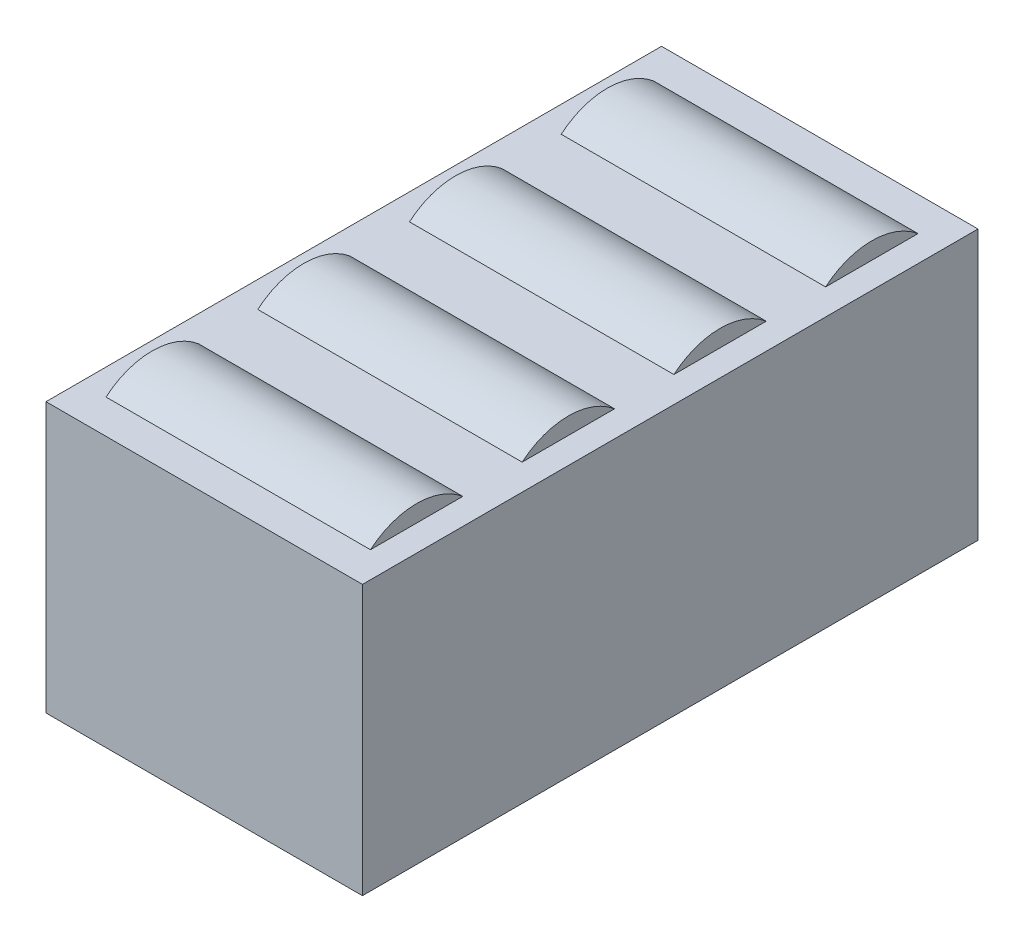
ISO-10303-21;
HEADER;
FILE_DESCRIPTION(('STEP AP214'),'2;1');
FILE_NAME('part.step','',(''),(''),'','','');
FILE_SCHEMA(('AUTOMOTIVE_DESIGN { 1 0 10303 214 1 1 1 1 }'));
ENDSEC;
DATA;
#1=APPLICATION_CONTEXT('core data for automotive mechanical design processes');
#2=APPLICATION_PROTOCOL_DEFINITION('international standard','automotive_design',2000,#1);
#3=PRODUCT_CONTEXT('',#1,'mechanical');
#4=PRODUCT('Part','Part','',(#3));
#5=PRODUCT_RELATED_PRODUCT_CATEGORY('part','',(#4));
#6=PRODUCT_DEFINITION_FORMATION('','',#4);
#7=PRODUCT_DEFINITION_CONTEXT('part definition',#1,'design');
#8=PRODUCT_DEFINITION('design','',#6,#7);
#9=PRODUCT_DEFINITION_SHAPE('','',#8);
#10=(LENGTH_UNIT() NAMED_UNIT(*) SI_UNIT(.MILLI.,.METRE.));
#11=(NAMED_UNIT(*) PLANE_ANGLE_UNIT() SI_UNIT($,.RADIAN.));
#12=(NAMED_UNIT(*) SI_UNIT($,.STERADIAN.) SOLID_ANGLE_UNIT());
#13=UNCERTAINTY_MEASURE_WITH_UNIT(LENGTH_MEASURE(1.E-05),#10,'distance_accuracy_value','');
#14=(GEOMETRIC_REPRESENTATION_CONTEXT(3) GLOBAL_UNCERTAINTY_ASSIGNED_CONTEXT((#13)) GLOBAL_UNIT_ASSIGNED_CONTEXT((#10,
#11,#12)) REPRESENTATION_CONTEXT('',''));
#15=CARTESIAN_POINT('',(0.,0.,0.));
#16=DIRECTION('',(0.,0.,1.));
#17=DIRECTION('',(1.,0.,0.));
#18=AXIS2_PLACEMENT_3D('',#15,#16,#17);
#19=CARTESIAN_POINT('',(0.,0.,142.));
#20=DIRECTION('',(0.,1.,0.));
#21=DIRECTION('',(0.,0.,1.));
#22=AXIS2_PLACEMENT_3D('',#19,#20,#21);
#23=PLANE('',#22);
#24=DIRECTION('',(0.,0.,1.));
#25=VECTOR('',#24,1.);
#26=CARTESIAN_POINT('',(67.,0.,142.));
#27=LINE('',#26,#25);
#28=CARTESIAN_POINT('',(67.,0.,42.8468314572612));
#29=VERTEX_POINT('',#28);
#30=CARTESIAN_POINT('',(67.,0.,64.1531685427388));
#31=VERTEX_POINT('',#30);
#32=EDGE_CURVE('E176',#29,#31,#27,.T.);
#33=ORIENTED_EDGE('',*,*,#32,.F.);
#34=DIRECTION('',(1.,0.,0.));
#35=VECTOR('',#34,1.);
#36=CARTESIAN_POINT('',(-46.6690475583122,0.,42.8468314572612));
#37=LINE('',#36,#35);
#38=CARTESIAN_POINT('',(6.,0.,42.8468314572612));
#39=VERTEX_POINT('',#38);
#40=EDGE_CURVE('E314',#29,#39,#37,.F.);
#41=ORIENTED_EDGE('',*,*,#40,.T.);
#42=DIRECTION('',(0.,0.,-1.));
#43=VECTOR('',#42,1.);
#44=CARTESIAN_POINT('',(6.,0.,142.));
#45=LINE('',#44,#43);
#46=CARTESIAN_POINT('',(6.,0.,64.1531685427388));
#47=VERTEX_POINT('',#46);
#48=EDGE_CURVE('E311',#47,#39,#45,.T.);
#49=ORIENTED_EDGE('',*,*,#48,.F.);
#50=DIRECTION('',(1.,0.,0.));
#51=VECTOR('',#50,1.);
#52=CARTESIAN_POINT('',(-46.6690475583122,0.,64.1531685427388));
#53=LINE('',#52,#51);
#54=EDGE_CURVE('E316',#47,#31,#53,.T.);
#55=ORIENTED_EDGE('',*,*,#54,.T.);
#56=EDGE_LOOP('',(#33,#41,#49,#55));
#57=FACE_BOUND('',#56,.T.);
#58=DIRECTION('',(0.,0.,1.));
#59=VECTOR('',#58,1.);
#60=CARTESIAN_POINT('',(67.,0.,142.));
#61=LINE('',#60,#59);
#62=CARTESIAN_POINT('',(67.,0.,112.846831457261));
#63=VERTEX_POINT('',#62);
#64=CARTESIAN_POINT('',(67.,0.,134.153168542739));
#65=VERTEX_POINT('',#64);
#66=EDGE_CURVE('E298',#63,#65,#61,.T.);
#67=ORIENTED_EDGE('',*,*,#66,.F.);
#68=DIRECTION('',(1.,0.,0.));
#69=VECTOR('',#68,1.);
#70=CARTESIAN_POINT('',(-46.6690475583122,0.,112.846831457261));
#71=LINE('',#70,#69);
#72=CARTESIAN_POINT('',(6.,0.,112.846831457261));
#73=VERTEX_POINT('',#72);
#74=EDGE_CURVE('E294',#63,#73,#71,.F.);
#75=ORIENTED_EDGE('',*,*,#74,.T.);
#76=DIRECTION('',(0.,0.,-1.));
#77=VECTOR('',#76,1.);
#78=CARTESIAN_POINT('',(6.,0.,142.));
#79=LINE('',#78,#77);
#80=CARTESIAN_POINT('',(6.,0.,134.153168542739));
#81=VERTEX_POINT('',#80);
#82=EDGE_CURVE('E291',#81,#73,#79,.T.);
#83=ORIENTED_EDGE('',*,*,#82,.F.);
#84=DIRECTION('',(1.,0.,0.));
#85=VECTOR('',#84,1.);
#86=CARTESIAN_POINT('',(-46.6690475583122,0.,134.153168542739));
#87=LINE('',#86,#85);
#88=EDGE_CURVE('E296',#81,#65,#87,.T.);
#89=ORIENTED_EDGE('',*,*,#88,.T.);
#90=EDGE_LOOP('',(#67,#75,#83,#89));
#91=FACE_BOUND('',#90,.T.);
#92=DIRECTION('',(1.,0.,0.));
#93=VECTOR('',#92,1.);
#94=CARTESIAN_POINT('',(0.,0.,0.));
#95=LINE('',#94,#93);
#96=CARTESIAN_POINT('',(0.,0.,0.));
#97=VERTEX_POINT('',#96);
#98=CARTESIAN_POINT('',(73.,0.,0.));
#99=VERTEX_POINT('',#98);
#100=EDGE_CURVE('E239',#97,#99,#95,.T.);
#101=ORIENTED_EDGE('',*,*,#100,.T.);
#102=DIRECTION('',(0.,0.,-1.));
#103=VECTOR('',#102,1.);
#104=CARTESIAN_POINT('',(73.,0.,142.));
#105=LINE('',#104,#103);
#106=CARTESIAN_POINT('',(73.,0.,142.));
#107=VERTEX_POINT('',#106);
#108=EDGE_CURVE('E249',#107,#99,#105,.T.);
#109=ORIENTED_EDGE('',*,*,#108,.F.);
#110=DIRECTION('',(1.,0.,0.));
#111=VECTOR('',#110,1.);
#112=CARTESIAN_POINT('',(0.,0.,142.));
#113=LINE('',#112,#111);
#114=CARTESIAN_POINT('',(0.,0.,142.));
#115=VERTEX_POINT('',#114);
#116=EDGE_CURVE('E229',#115,#107,#113,.T.);
#117=ORIENTED_EDGE('',*,*,#116,.F.);
#118=DIRECTION('',(0.,0.,-1.));
#119=VECTOR('',#118,1.);
#120=CARTESIAN_POINT('',(0.,0.,142.));
#121=LINE('',#120,#119);
#122=EDGE_CURVE('E252',#115,#97,#121,.T.);
#123=ORIENTED_EDGE('',*,*,#122,.T.);
#124=EDGE_LOOP('',(#101,#109,#117,#123));
#125=FACE_BOUND('',#124,.T.);
#126=DIRECTION('',(0.,0.,1.));
#127=VECTOR('',#126,1.);
#128=CARTESIAN_POINT('',(67.,0.,142.));
#129=LINE('',#128,#127);
#130=CARTESIAN_POINT('',(67.,0.,77.8468314572612));
#131=VERTEX_POINT('',#130);
#132=CARTESIAN_POINT('',(67.,0.,99.1531685427388));
#133=VERTEX_POINT('',#132);
#134=EDGE_CURVE('E308',#131,#133,#129,.T.);
#135=ORIENTED_EDGE('',*,*,#134,.F.);
#136=DIRECTION('',(1.,0.,0.));
#137=VECTOR('',#136,1.);
#138=CARTESIAN_POINT('',(-46.6690475583122,0.,77.8468314572612));
#139=LINE('',#138,#137);
#140=CARTESIAN_POINT('',(6.,0.,77.8468314572612));
#141=VERTEX_POINT('',#140);
#142=EDGE_CURVE('E304',#131,#141,#139,.F.);
#143=ORIENTED_EDGE('',*,*,#142,.T.);
#144=DIRECTION('',(0.,0.,-1.));
#145=VECTOR('',#144,1.);
#146=CARTESIAN_POINT('',(6.,0.,142.));
#147=LINE('',#146,#145);
#148=CARTESIAN_POINT('',(6.,0.,99.1531685427388));
#149=VERTEX_POINT('',#148);
#150=EDGE_CURVE('E301',#149,#141,#147,.T.);
#151=ORIENTED_EDGE('',*,*,#150,.F.);
#152=DIRECTION('',(1.,0.,0.));
#153=VECTOR('',#152,1.);
#154=CARTESIAN_POINT('',(-46.6690475583122,0.,99.1531685427388));
#155=LINE('',#154,#153);
#156=EDGE_CURVE('E306',#149,#133,#155,.T.);
#157=ORIENTED_EDGE('',*,*,#156,.T.);
#158=EDGE_LOOP('',(#135,#143,#151,#157));
#159=FACE_BOUND('',#158,.T.);
#160=DIRECTION('',(0.,0.,1.));
#161=VECTOR('',#160,1.);
#162=CARTESIAN_POINT('',(67.,0.,142.));
#163=LINE('',#162,#161);
#164=CARTESIAN_POINT('',(67.,0.,7.84683145726116));
#165=VERTEX_POINT('',#164);
#166=CARTESIAN_POINT('',(67.,0.,29.1531685427388));
#167=VERTEX_POINT('',#166);
#168=EDGE_CURVE('E12',#165,#167,#163,.T.);
#169=ORIENTED_EDGE('',*,*,#168,.F.);
#170=DIRECTION('',(1.,0.,0.));
#171=VECTOR('',#170,1.);
#172=CARTESIAN_POINT('',(-46.6690475583122,0.,7.84683145726116));
#173=LINE('',#172,#171);
#174=CARTESIAN_POINT('',(6.,0.,7.84683145726116));
#175=VERTEX_POINT('',#174);
#176=EDGE_CURVE('E164',#165,#175,#173,.F.);
#177=ORIENTED_EDGE('',*,*,#176,.T.);
#178=DIRECTION('',(0.,0.,-1.));
#179=VECTOR('',#178,1.);
#180=CARTESIAN_POINT('',(6.,0.,142.));
#181=LINE('',#180,#179);
#182=CARTESIAN_POINT('',(6.,0.,29.1531685427388));
#183=VERTEX_POINT('',#182);
#184=EDGE_CURVE('E166',#183,#175,#181,.T.);
#185=ORIENTED_EDGE('',*,*,#184,.F.);
#186=DIRECTION('',(1.,0.,0.));
#187=VECTOR('',#186,1.);
#188=CARTESIAN_POINT('',(-46.6690475583122,0.,29.1531685427388));
#189=LINE('',#188,#187);
#190=EDGE_CURVE('E43',#183,#167,#189,.T.);
#191=ORIENTED_EDGE('',*,*,#190,.T.);
#192=EDGE_LOOP('',(#169,#177,#185,#191));
#193=FACE_BOUND('',#192,.T.);
#194=ADVANCED_FACE('F35',(#57,#91,#125,#159,#193),#23,.F.);
#195=CARTESIAN_POINT('',(0.,0.,142.));
#196=DIRECTION('',(1.,0.,0.));
#197=DIRECTION('',(0.,0.,-1.));
#198=AXIS2_PLACEMENT_3D('',#195,#196,#197);
#199=PLANE('',#198);
#200=DIRECTION('',(0.,-1.,0.));
#201=VECTOR('',#200,1.);
#202=CARTESIAN_POINT('',(0.,0.,0.));
#203=LINE('',#202,#201);
#204=CARTESIAN_POINT('',(0.,62.2,0.));
#205=VERTEX_POINT('',#204);
#206=EDGE_CURVE('E225',#205,#97,#203,.T.);
#207=ORIENTED_EDGE('',*,*,#206,.T.);
#208=ORIENTED_EDGE('',*,*,#122,.F.);
#209=DIRECTION('',(0.,-1.,0.));
#210=VECTOR('',#209,1.);
#211=CARTESIAN_POINT('',(0.,0.,142.));
#212=LINE('',#211,#210);
#213=CARTESIAN_POINT('',(0.,62.2,142.));
#214=VERTEX_POINT('',#213);
#215=EDGE_CURVE('E226',#214,#115,#212,.T.);
#216=ORIENTED_EDGE('',*,*,#215,.F.);
#217=DIRECTION('',(0.,0.,-1.));
#218=VECTOR('',#217,1.);
#219=CARTESIAN_POINT('',(0.,62.2,142.));
#220=LINE('',#219,#218);
#221=EDGE_CURVE('E236',#214,#205,#220,.T.);
#222=ORIENTED_EDGE('',*,*,#221,.T.);
#223=EDGE_LOOP('',(#207,#208,#216,#222));
#224=FACE_BOUND('',#223,.T.);
#225=ADVANCED_FACE('F37',(#224),#199,.F.);
#226=CARTESIAN_POINT('',(73.,0.,142.));
#227=DIRECTION('',(-1.,0.,0.));
#228=DIRECTION('',(0.,0.,1.));
#229=AXIS2_PLACEMENT_3D('',#226,#227,#228);
#230=PLANE('',#229);
#231=DIRECTION('',(0.,1.,0.));
#232=VECTOR('',#231,1.);
#233=CARTESIAN_POINT('',(73.,0.,0.));
#234=LINE('',#233,#232);
#235=CARTESIAN_POINT('',(73.,62.2,0.));
#236=VERTEX_POINT('',#235);
#237=EDGE_CURVE('E241',#99,#236,#234,.T.);
#238=ORIENTED_EDGE('',*,*,#237,.T.);
#239=DIRECTION('',(0.,0.,-1.));
#240=VECTOR('',#239,1.);
#241=CARTESIAN_POINT('',(73.,62.2,142.));
#242=LINE('',#241,#240);
#243=CARTESIAN_POINT('',(73.,62.2,142.));
#244=VERTEX_POINT('',#243);
#245=EDGE_CURVE('E246',#244,#236,#242,.T.);
#246=ORIENTED_EDGE('',*,*,#245,.F.);
#247=DIRECTION('',(0.,1.,0.));
#248=VECTOR('',#247,1.);
#249=CARTESIAN_POINT('',(73.,0.,142.));
#250=LINE('',#249,#248);
#251=EDGE_CURVE('E232',#107,#244,#250,.T.);
#252=ORIENTED_EDGE('',*,*,#251,.F.);
#253=ORIENTED_EDGE('',*,*,#108,.T.);
#254=EDGE_LOOP('',(#238,#246,#252,#253));
#255=FACE_BOUND('',#254,.T.);
#256=ADVANCED_FACE('F344',(#255),#230,.F.);
#257=CARTESIAN_POINT('',(0.,62.2,142.));
#258=DIRECTION('',(0.,-1.,0.));
#259=DIRECTION('',(0.,0.,-1.));
#260=AXIS2_PLACEMENT_3D('',#257,#258,#259);
#261=PLANE('',#260);
#262=DIRECTION('',(1.,0.,0.));
#263=VECTOR('',#262,1.);
#264=CARTESIAN_POINT('',(-46.6690475583122,62.2,7.84683145726118));
#265=LINE('',#264,#263);
#266=CARTESIAN_POINT('',(6.,62.2,7.84683145726118));
#267=VERTEX_POINT('',#266);
#268=CARTESIAN_POINT('',(67.,62.2,7.84683145726118));
#269=VERTEX_POINT('',#268);
#270=EDGE_CURVE('E287',#267,#269,#265,.T.);
#271=ORIENTED_EDGE('',*,*,#270,.T.);
#272=DIRECTION('',(0.,0.,1.));
#273=VECTOR('',#272,1.);
#274=CARTESIAN_POINT('',(67.,62.2,142.));
#275=LINE('',#274,#273);
#276=CARTESIAN_POINT('',(67.,62.2,29.1531685427388));
#277=VERTEX_POINT('',#276);
#278=EDGE_CURVE('E289',#269,#277,#275,.T.);
#279=ORIENTED_EDGE('',*,*,#278,.T.);
#280=DIRECTION('',(1.,0.,0.));
#281=VECTOR('',#280,1.);
#282=CARTESIAN_POINT('',(-46.6690475583122,62.2,29.1531685427388));
#283=LINE('',#282,#281);
#284=CARTESIAN_POINT('',(6.,62.2,29.1531685427388));
#285=VERTEX_POINT('',#284);
#286=EDGE_CURVE('E285',#277,#285,#283,.F.);
#287=ORIENTED_EDGE('',*,*,#286,.T.);
#288=DIRECTION('',(0.,0.,1.));
#289=VECTOR('',#288,1.);
#290=CARTESIAN_POINT('',(6.,62.2,142.));
#291=LINE('',#290,#289);
#292=EDGE_CURVE('E282',#267,#285,#291,.T.);
#293=ORIENTED_EDGE('',*,*,#292,.F.);
#294=EDGE_LOOP('',(#271,#279,#287,#293));
#295=FACE_BOUND('',#294,.T.);
#296=DIRECTION('',(1.,0.,0.));
#297=VECTOR('',#296,1.);
#298=CARTESIAN_POINT('',(-46.6690475583122,62.2,42.8468314572612));
#299=LINE('',#298,#297);
#300=CARTESIAN_POINT('',(6.,62.2,42.8468314572612));
#301=VERTEX_POINT('',#300);
#302=CARTESIAN_POINT('',(67.,62.2,42.8468314572612));
#303=VERTEX_POINT('',#302);
#304=EDGE_CURVE('E278',#301,#303,#299,.T.);
#305=ORIENTED_EDGE('',*,*,#304,.T.);
#306=DIRECTION('',(0.,0.,1.));
#307=VECTOR('',#306,1.);
#308=CARTESIAN_POINT('',(67.,62.2,142.));
#309=LINE('',#308,#307);
#310=CARTESIAN_POINT('',(67.,62.2,64.1531685427388));
#311=VERTEX_POINT('',#310);
#312=EDGE_CURVE('E280',#303,#311,#309,.T.);
#313=ORIENTED_EDGE('',*,*,#312,.T.);
#314=DIRECTION('',(1.,0.,0.));
#315=VECTOR('',#314,1.);
#316=CARTESIAN_POINT('',(-46.6690475583122,62.2,64.1531685427388));
#317=LINE('',#316,#315);
#318=CARTESIAN_POINT('',(6.,62.2,64.1531685427388));
#319=VERTEX_POINT('',#318);
#320=EDGE_CURVE('E276',#311,#319,#317,.F.);
#321=ORIENTED_EDGE('',*,*,#320,.T.);
#322=DIRECTION('',(0.,0.,1.));
#323=VECTOR('',#322,1.);
#324=CARTESIAN_POINT('',(6.,62.2,142.));
#325=LINE('',#324,#323);
#326=EDGE_CURVE('E273',#301,#319,#325,.T.);
#327=ORIENTED_EDGE('',*,*,#326,.F.);
#328=EDGE_LOOP('',(#305,#313,#321,#327));
#329=FACE_BOUND('',#328,.T.);
#330=DIRECTION('',(1.,0.,0.));
#331=VECTOR('',#330,1.);
#332=CARTESIAN_POINT('',(-46.6690475583122,62.2,77.8468314572612));
#333=LINE('',#332,#331);
#334=CARTESIAN_POINT('',(6.,62.2,77.8468314572612));
#335=VERTEX_POINT('',#334);
#336=CARTESIAN_POINT('',(67.,62.2,77.8468314572612));
#337=VERTEX_POINT('',#336);
#338=EDGE_CURVE('E269',#335,#337,#333,.T.);
#339=ORIENTED_EDGE('',*,*,#338,.T.);
#340=DIRECTION('',(0.,0.,1.));
#341=VECTOR('',#340,1.);
#342=CARTESIAN_POINT('',(67.,62.2,142.));
#343=LINE('',#342,#341);
#344=CARTESIAN_POINT('',(67.,62.2,99.1531685427388));
#345=VERTEX_POINT('',#344);
#346=EDGE_CURVE('E271',#337,#345,#343,.T.);
#347=ORIENTED_EDGE('',*,*,#346,.T.);
#348=DIRECTION('',(1.,0.,0.));
#349=VECTOR('',#348,1.);
#350=CARTESIAN_POINT('',(-46.6690475583122,62.2,99.1531685427388));
#351=LINE('',#350,#349);
#352=CARTESIAN_POINT('',(6.,62.2,99.1531685427388));
#353=VERTEX_POINT('',#352);
#354=EDGE_CURVE('E267',#345,#353,#351,.F.);
#355=ORIENTED_EDGE('',*,*,#354,.T.);
#356=DIRECTION('',(0.,0.,1.));
#357=VECTOR('',#356,1.);
#358=CARTESIAN_POINT('',(6.,62.2,142.));
#359=LINE('',#358,#357);
#360=EDGE_CURVE('E264',#335,#353,#359,.T.);
#361=ORIENTED_EDGE('',*,*,#360,.F.);
#362=EDGE_LOOP('',(#339,#347,#355,#361));
#363=FACE_BOUND('',#362,.T.);
#364=DIRECTION('',(1.,0.,0.));
#365=VECTOR('',#364,1.);
#366=CARTESIAN_POINT('',(-46.6690475583122,62.2,112.846831457261));
#367=LINE('',#366,#365);
#368=CARTESIAN_POINT('',(6.,62.2,112.846831457261));
#369=VERTEX_POINT('',#368);
#370=CARTESIAN_POINT('',(67.,62.2,112.846831457261));
#371=VERTEX_POINT('',#370);
#372=EDGE_CURVE('E260',#369,#371,#367,.T.);
#373=ORIENTED_EDGE('',*,*,#372,.T.);
#374=DIRECTION('',(0.,0.,1.));
#375=VECTOR('',#374,1.);
#376=CARTESIAN_POINT('',(67.,62.2,142.));
#377=LINE('',#376,#375);
#378=CARTESIAN_POINT('',(67.,62.2,134.153168542739));
#379=VERTEX_POINT('',#378);
#380=EDGE_CURVE('E262',#371,#379,#377,.T.);
#381=ORIENTED_EDGE('',*,*,#380,.T.);
#382=DIRECTION('',(1.,0.,0.));
#383=VECTOR('',#382,1.);
#384=CARTESIAN_POINT('',(-46.6690475583122,62.2,134.153168542739));
#385=LINE('',#384,#383);
#386=CARTESIAN_POINT('',(6.,62.2,134.153168542739));
#387=VERTEX_POINT('',#386);
#388=EDGE_CURVE('E258',#379,#387,#385,.F.);
#389=ORIENTED_EDGE('',*,*,#388,.T.);
#390=DIRECTION('',(0.,0.,1.));
#391=VECTOR('',#390,1.);
#392=CARTESIAN_POINT('',(6.,62.2,142.));
#393=LINE('',#392,#391);
#394=EDGE_CURVE('E255',#369,#387,#393,.T.);
#395=ORIENTED_EDGE('',*,*,#394,.F.);
#396=EDGE_LOOP('',(#373,#381,#389,#395));
#397=FACE_BOUND('',#396,.T.);
#398=DIRECTION('',(-1.,0.,0.));
#399=VECTOR('',#398,1.);
#400=CARTESIAN_POINT('',(0.,62.2,0.));
#401=LINE('',#400,#399);
#402=EDGE_CURVE('E230',#236,#205,#401,.T.);
#403=ORIENTED_EDGE('',*,*,#402,.T.);
#404=ORIENTED_EDGE('',*,*,#221,.F.);
#405=DIRECTION('',(-1.,0.,0.));
#406=VECTOR('',#405,1.);
#407=CARTESIAN_POINT('',(0.,62.2,142.));
#408=LINE('',#407,#406);
#409=EDGE_CURVE('E234',#244,#214,#408,.T.);
#410=ORIENTED_EDGE('',*,*,#409,.F.);
#411=ORIENTED_EDGE('',*,*,#245,.T.);
#412=EDGE_LOOP('',(#403,#404,#410,#411));
#413=FACE_BOUND('',#412,.T.);
#414=ADVANCED_FACE('F349',(#295,#329,#363,#397,#413),#261,.F.);
#415=CARTESIAN_POINT('',(0.,0.,142.));
#416=DIRECTION('',(0.,0.,-1.));
#417=DIRECTION('',(-1.,0.,0.));
#418=AXIS2_PLACEMENT_3D('',#415,#416,#417);
#419=PLANE('',#418);
#420=ORIENTED_EDGE('',*,*,#215,.T.);
#421=ORIENTED_EDGE('',*,*,#116,.T.);
#422=ORIENTED_EDGE('',*,*,#251,.T.);
#423=ORIENTED_EDGE('',*,*,#409,.T.);
#424=EDGE_LOOP('',(#420,#421,#422,#423));
#425=FACE_BOUND('',#424,.T.);
#426=ADVANCED_FACE('F353',(#425),#419,.F.);
#427=CARTESIAN_POINT('',(0.,0.,0.));
#428=DIRECTION('',(0.,0.,-1.));
#429=DIRECTION('',(-1.,0.,0.));
#430=AXIS2_PLACEMENT_3D('',#427,#428,#429);
#431=PLANE('',#430);
#432=ORIENTED_EDGE('',*,*,#206,.F.);
#433=ORIENTED_EDGE('',*,*,#402,.F.);
#434=ORIENTED_EDGE('',*,*,#237,.F.);
#435=ORIENTED_EDGE('',*,*,#100,.F.);
#436=EDGE_LOOP('',(#432,#433,#434,#435));
#437=FACE_BOUND('',#436,.T.);
#438=ADVANCED_FACE('F355',(#437),#431,.T.);
#439=CARTESIAN_POINT('',(-46.6690475583122,49.6,123.5));
#440=DIRECTION('',(1.,0.,0.));
#441=DIRECTION('',(0.,0.,-1.));
#442=AXIS2_PLACEMENT_3D('',#439,#440,#441);
#443=CYLINDRICAL_SURFACE('',#442,16.5);
#444=ORIENTED_EDGE('',*,*,#372,.F.);
#445=CARTESIAN_POINT('',(6.,49.6,123.5));
#446=DIRECTION('',(1.,0.,0.));
#447=DIRECTION('',(0.,0.,-1.));
#448=AXIS2_PLACEMENT_3D('',#445,#446,#447);
#449=CIRCLE('',#448,16.5);
#450=EDGE_CURVE('E222',#387,#369,#449,.F.);
#451=ORIENTED_EDGE('',*,*,#450,.F.);
#452=ORIENTED_EDGE('',*,*,#388,.F.);
#453=CARTESIAN_POINT('',(67.,49.6,123.5));
#454=DIRECTION('',(1.,0.,0.));
#455=DIRECTION('',(0.,0.,-1.));
#456=AXIS2_PLACEMENT_3D('',#453,#454,#455);
#457=CIRCLE('',#456,16.5);
#458=EDGE_CURVE('E219',#371,#379,#457,.T.);
#459=ORIENTED_EDGE('',*,*,#458,.F.);
#460=EDGE_LOOP('',(#444,#451,#452,#459));
#461=FACE_BOUND('',#460,.T.);
#462=ADVANCED_FACE('F358',(#461),#443,.T.);
#463=CARTESIAN_POINT('',(67.,49.6,123.5));
#464=DIRECTION('',(1.,0.,0.));
#465=DIRECTION('',(0.,0.,-1.));
#466=AXIS2_PLACEMENT_3D('',#463,#464,#465);
#467=PLANE('',#466);
#468=ORIENTED_EDGE('',*,*,#380,.F.);
#469=ORIENTED_EDGE('',*,*,#458,.T.);
#470=EDGE_LOOP('',(#468,#469));
#471=FACE_BOUND('',#470,.T.);
#472=ADVANCED_FACE('F365',(#471),#467,.T.);
#473=CARTESIAN_POINT('',(6.,0.,142.));
#474=DIRECTION('',(1.,0.,0.));
#475=DIRECTION('',(0.,0.,-1.));
#476=AXIS2_PLACEMENT_3D('',#473,#474,#475);
#477=PLANE('',#476);
#478=ORIENTED_EDGE('',*,*,#450,.T.);
#479=ORIENTED_EDGE('',*,*,#394,.T.);
#480=EDGE_LOOP('',(#478,#479));
#481=FACE_BOUND('',#480,.T.);
#482=ADVANCED_FACE('F369',(#481),#477,.F.);
#483=CARTESIAN_POINT('',(-46.6690475583122,49.6,88.5));
#484=DIRECTION('',(1.,0.,0.));
#485=DIRECTION('',(0.,0.,-1.));
#486=AXIS2_PLACEMENT_3D('',#483,#484,#485);
#487=CYLINDRICAL_SURFACE('',#486,16.5);
#488=ORIENTED_EDGE('',*,*,#338,.F.);
#489=CARTESIAN_POINT('',(6.,49.6,88.5));
#490=DIRECTION('',(1.,0.,0.));
#491=DIRECTION('',(0.,0.,-1.));
#492=AXIS2_PLACEMENT_3D('',#489,#490,#491);
#493=CIRCLE('',#492,16.5);
#494=EDGE_CURVE('E216',#353,#335,#493,.F.);
#495=ORIENTED_EDGE('',*,*,#494,.F.);
#496=ORIENTED_EDGE('',*,*,#354,.F.);
#497=CARTESIAN_POINT('',(67.,49.6,88.5));
#498=DIRECTION('',(1.,0.,0.));
#499=DIRECTION('',(0.,0.,-1.));
#500=AXIS2_PLACEMENT_3D('',#497,#498,#499);
#501=CIRCLE('',#500,16.5);
#502=EDGE_CURVE('E213',#337,#345,#501,.T.);
#503=ORIENTED_EDGE('',*,*,#502,.F.);
#504=EDGE_LOOP('',(#488,#495,#496,#503));
#505=FACE_BOUND('',#504,.T.);
#506=ADVANCED_FACE('F373',(#505),#487,.T.);
#507=CARTESIAN_POINT('',(67.,49.6,88.5));
#508=DIRECTION('',(1.,0.,0.));
#509=DIRECTION('',(0.,0.,-1.));
#510=AXIS2_PLACEMENT_3D('',#507,#508,#509);
#511=PLANE('',#510);
#512=ORIENTED_EDGE('',*,*,#346,.F.);
#513=ORIENTED_EDGE('',*,*,#502,.T.);
#514=EDGE_LOOP('',(#512,#513));
#515=FACE_BOUND('',#514,.T.);
#516=ADVANCED_FACE('F377',(#515),#511,.T.);
#517=CARTESIAN_POINT('',(6.,0.,142.));
#518=DIRECTION('',(1.,0.,0.));
#519=DIRECTION('',(0.,0.,-1.));
#520=AXIS2_PLACEMENT_3D('',#517,#518,#519);
#521=PLANE('',#520);
#522=ORIENTED_EDGE('',*,*,#494,.T.);
#523=ORIENTED_EDGE('',*,*,#360,.T.);
#524=EDGE_LOOP('',(#522,#523));
#525=FACE_BOUND('',#524,.T.);
#526=ADVANCED_FACE('F381',(#525),#521,.F.);
#527=CARTESIAN_POINT('',(-46.6690475583122,49.6,53.5));
#528=DIRECTION('',(1.,0.,0.));
#529=DIRECTION('',(0.,0.,-1.));
#530=AXIS2_PLACEMENT_3D('',#527,#528,#529);
#531=CYLINDRICAL_SURFACE('',#530,16.5);
#532=ORIENTED_EDGE('',*,*,#304,.F.);
#533=CARTESIAN_POINT('',(6.,49.6,53.5));
#534=DIRECTION('',(1.,0.,0.));
#535=DIRECTION('',(0.,0.,-1.));
#536=AXIS2_PLACEMENT_3D('',#533,#534,#535);
#537=CIRCLE('',#536,16.5);
#538=EDGE_CURVE('E210',#319,#301,#537,.F.);
#539=ORIENTED_EDGE('',*,*,#538,.F.);
#540=ORIENTED_EDGE('',*,*,#320,.F.);
#541=CARTESIAN_POINT('',(67.,49.6,53.5));
#542=DIRECTION('',(1.,0.,0.));
#543=DIRECTION('',(0.,0.,-1.));
#544=AXIS2_PLACEMENT_3D('',#541,#542,#543);
#545=CIRCLE('',#544,16.5);
#546=EDGE_CURVE('E207',#303,#311,#545,.T.);
#547=ORIENTED_EDGE('',*,*,#546,.F.);
#548=EDGE_LOOP('',(#532,#539,#540,#547));
#549=FACE_BOUND('',#548,.T.);
#550=ADVANCED_FACE('F385',(#549),#531,.T.);
#551=CARTESIAN_POINT('',(67.,49.6,53.5));
#552=DIRECTION('',(1.,0.,0.));
#553=DIRECTION('',(0.,0.,-1.));
#554=AXIS2_PLACEMENT_3D('',#551,#552,#553);
#555=PLANE('',#554);
#556=ORIENTED_EDGE('',*,*,#312,.F.);
#557=ORIENTED_EDGE('',*,*,#546,.T.);
#558=EDGE_LOOP('',(#556,#557));
#559=FACE_BOUND('',#558,.T.);
#560=ADVANCED_FACE('F389',(#559),#555,.T.);
#561=CARTESIAN_POINT('',(6.,0.,142.));
#562=DIRECTION('',(1.,0.,0.));
#563=DIRECTION('',(0.,0.,-1.));
#564=AXIS2_PLACEMENT_3D('',#561,#562,#563);
#565=PLANE('',#564);
#566=ORIENTED_EDGE('',*,*,#538,.T.);
#567=ORIENTED_EDGE('',*,*,#326,.T.);
#568=EDGE_LOOP('',(#566,#567));
#569=FACE_BOUND('',#568,.T.);
#570=ADVANCED_FACE('F393',(#569),#565,.F.);
#571=CARTESIAN_POINT('',(-46.6690475583122,49.6,18.5));
#572=DIRECTION('',(1.,0.,0.));
#573=DIRECTION('',(0.,0.,-1.));
#574=AXIS2_PLACEMENT_3D('',#571,#572,#573);
#575=CYLINDRICAL_SURFACE('',#574,16.5);
#576=ORIENTED_EDGE('',*,*,#270,.F.);
#577=CARTESIAN_POINT('',(6.,49.6,18.5));
#578=DIRECTION('',(1.,0.,0.));
#579=DIRECTION('',(0.,0.,-1.));
#580=AXIS2_PLACEMENT_3D('',#577,#578,#579);
#581=CIRCLE('',#580,16.5);
#582=EDGE_CURVE('E204',#285,#267,#581,.F.);
#583=ORIENTED_EDGE('',*,*,#582,.F.);
#584=ORIENTED_EDGE('',*,*,#286,.F.);
#585=CARTESIAN_POINT('',(67.,49.6,18.5));
#586=DIRECTION('',(1.,0.,0.));
#587=DIRECTION('',(0.,0.,-1.));
#588=AXIS2_PLACEMENT_3D('',#585,#586,#587);
#589=CIRCLE('',#588,16.5);
#590=EDGE_CURVE('E201',#269,#277,#589,.T.);
#591=ORIENTED_EDGE('',*,*,#590,.F.);
#592=EDGE_LOOP('',(#576,#583,#584,#591));
#593=FACE_BOUND('',#592,.T.);
#594=ADVANCED_FACE('F397',(#593),#575,.T.);
#595=CARTESIAN_POINT('',(67.,49.6,18.5));
#596=DIRECTION('',(1.,0.,0.));
#597=DIRECTION('',(0.,0.,-1.));
#598=AXIS2_PLACEMENT_3D('',#595,#596,#597);
#599=PLANE('',#598);
#600=ORIENTED_EDGE('',*,*,#278,.F.);
#601=ORIENTED_EDGE('',*,*,#590,.T.);
#602=EDGE_LOOP('',(#600,#601));
#603=FACE_BOUND('',#602,.T.);
#604=ADVANCED_FACE('F401',(#603),#599,.T.);
#605=CARTESIAN_POINT('',(6.,0.,142.));
#606=DIRECTION('',(1.,0.,0.));
#607=DIRECTION('',(0.,0.,-1.));
#608=AXIS2_PLACEMENT_3D('',#605,#606,#607);
#609=PLANE('',#608);
#610=ORIENTED_EDGE('',*,*,#582,.T.);
#611=ORIENTED_EDGE('',*,*,#292,.T.);
#612=EDGE_LOOP('',(#610,#611));
#613=FACE_BOUND('',#612,.T.);
#614=ADVANCED_FACE('F405',(#613),#609,.F.);
#615=CARTESIAN_POINT('',(-46.6690475583122,12.6,123.5));
#616=DIRECTION('',(1.,0.,0.));
#617=DIRECTION('',(0.,0.,-1.));
#618=AXIS2_PLACEMENT_3D('',#615,#616,#617);
#619=CYLINDRICAL_SURFACE('',#618,16.5);
#620=ORIENTED_EDGE('',*,*,#88,.F.);
#621=CARTESIAN_POINT('',(6.,12.6,123.5));
#622=DIRECTION('',(1.,0.,0.));
#623=DIRECTION('',(0.,0.,-1.));
#624=AXIS2_PLACEMENT_3D('',#621,#622,#623);
#625=CIRCLE('',#624,16.5);
#626=EDGE_CURVE('E198',#73,#81,#625,.F.);
#627=ORIENTED_EDGE('',*,*,#626,.F.);
#628=ORIENTED_EDGE('',*,*,#74,.F.);
#629=CARTESIAN_POINT('',(67.,12.6,123.5));
#630=DIRECTION('',(1.,0.,0.));
#631=DIRECTION('',(0.,0.,1.));
#632=AXIS2_PLACEMENT_3D('',#629,#630,#631);
#633=CIRCLE('',#632,16.5);
#634=EDGE_CURVE('E195',#65,#63,#633,.T.);
#635=ORIENTED_EDGE('',*,*,#634,.F.);
#636=EDGE_LOOP('',(#620,#627,#628,#635));
#637=FACE_BOUND('',#636,.T.);
#638=ADVANCED_FACE('F409',(#637),#619,.T.);
#639=CARTESIAN_POINT('',(67.,12.6,123.5));
#640=DIRECTION('',(-1.,0.,0.));
#641=DIRECTION('',(0.,0.,1.));
#642=AXIS2_PLACEMENT_3D('',#639,#640,#641);
#643=PLANE('',#642);
#644=ORIENTED_EDGE('',*,*,#634,.T.);
#645=ORIENTED_EDGE('',*,*,#66,.T.);
#646=EDGE_LOOP('',(#644,#645));
#647=FACE_BOUND('',#646,.T.);
#648=ADVANCED_FACE('F413',(#647),#643,.F.);
#649=CARTESIAN_POINT('',(6.,0.,142.));
#650=DIRECTION('',(1.,0.,0.));
#651=DIRECTION('',(0.,0.,-1.));
#652=AXIS2_PLACEMENT_3D('',#649,#650,#651);
#653=PLANE('',#652);
#654=ORIENTED_EDGE('',*,*,#626,.T.);
#655=ORIENTED_EDGE('',*,*,#82,.T.);
#656=EDGE_LOOP('',(#654,#655));
#657=FACE_BOUND('',#656,.T.);
#658=ADVANCED_FACE('F417',(#657),#653,.F.);
#659=CARTESIAN_POINT('',(-46.6690475583122,12.6,88.5));
#660=DIRECTION('',(1.,0.,0.));
#661=DIRECTION('',(0.,0.,-1.));
#662=AXIS2_PLACEMENT_3D('',#659,#660,#661);
#663=CYLINDRICAL_SURFACE('',#662,16.5);
#664=ORIENTED_EDGE('',*,*,#156,.F.);
#665=CARTESIAN_POINT('',(6.,12.6,88.5));
#666=DIRECTION('',(1.,0.,0.));
#667=DIRECTION('',(0.,0.,-1.));
#668=AXIS2_PLACEMENT_3D('',#665,#666,#667);
#669=CIRCLE('',#668,16.5);
#670=EDGE_CURVE('E192',#141,#149,#669,.F.);
#671=ORIENTED_EDGE('',*,*,#670,.F.);
#672=ORIENTED_EDGE('',*,*,#142,.F.);
#673=CARTESIAN_POINT('',(67.,12.6,88.5));
#674=DIRECTION('',(1.,0.,0.));
#675=DIRECTION('',(0.,0.,1.));
#676=AXIS2_PLACEMENT_3D('',#673,#674,#675);
#677=CIRCLE('',#676,16.5);
#678=EDGE_CURVE('E189',#133,#131,#677,.T.);
#679=ORIENTED_EDGE('',*,*,#678,.F.);
#680=EDGE_LOOP('',(#664,#671,#672,#679));
#681=FACE_BOUND('',#680,.T.);
#682=ADVANCED_FACE('F421',(#681),#663,.T.);
#683=CARTESIAN_POINT('',(67.,12.6,88.5));
#684=DIRECTION('',(-1.,0.,0.));
#685=DIRECTION('',(0.,0.,1.));
#686=AXIS2_PLACEMENT_3D('',#683,#684,#685);
#687=PLANE('',#686);
#688=ORIENTED_EDGE('',*,*,#678,.T.);
#689=ORIENTED_EDGE('',*,*,#134,.T.);
#690=EDGE_LOOP('',(#688,#689));
#691=FACE_BOUND('',#690,.T.);
#692=ADVANCED_FACE('F425',(#691),#687,.F.);
#693=CARTESIAN_POINT('',(6.,0.,142.));
#694=DIRECTION('',(1.,0.,0.));
#695=DIRECTION('',(0.,0.,-1.));
#696=AXIS2_PLACEMENT_3D('',#693,#694,#695);
#697=PLANE('',#696);
#698=ORIENTED_EDGE('',*,*,#670,.T.);
#699=ORIENTED_EDGE('',*,*,#150,.T.);
#700=EDGE_LOOP('',(#698,#699));
#701=FACE_BOUND('',#700,.T.);
#702=ADVANCED_FACE('F429',(#701),#697,.F.);
#703=CARTESIAN_POINT('',(-46.6690475583122,12.6,53.5));
#704=DIRECTION('',(1.,0.,0.));
#705=DIRECTION('',(0.,0.,-1.));
#706=AXIS2_PLACEMENT_3D('',#703,#704,#705);
#707=CYLINDRICAL_SURFACE('',#706,16.5);
#708=ORIENTED_EDGE('',*,*,#54,.F.);
#709=CARTESIAN_POINT('',(6.,12.6,53.5));
#710=DIRECTION('',(1.,0.,0.));
#711=DIRECTION('',(0.,0.,-1.));
#712=AXIS2_PLACEMENT_3D('',#709,#710,#711);
#713=CIRCLE('',#712,16.5);
#714=EDGE_CURVE('E183',#39,#47,#713,.F.);
#715=ORIENTED_EDGE('',*,*,#714,.F.);
#716=ORIENTED_EDGE('',*,*,#40,.F.);
#717=CARTESIAN_POINT('',(67.,12.6,53.5));
#718=DIRECTION('',(1.,0.,0.));
#719=DIRECTION('',(0.,0.,1.));
#720=AXIS2_PLACEMENT_3D('',#717,#718,#719);
#721=CIRCLE('',#720,16.5);
#722=EDGE_CURVE('E179',#31,#29,#721,.T.);
#723=ORIENTED_EDGE('',*,*,#722,.F.);
#724=EDGE_LOOP('',(#708,#715,#716,#723));
#725=FACE_BOUND('',#724,.T.);
#726=ADVANCED_FACE('F326',(#725),#707,.T.);
#727=CARTESIAN_POINT('',(67.,12.6,53.5));
#728=DIRECTION('',(-1.,0.,0.));
#729=DIRECTION('',(0.,0.,1.));
#730=AXIS2_PLACEMENT_3D('',#727,#728,#729);
#731=PLANE('',#730);
#732=ORIENTED_EDGE('',*,*,#722,.T.);
#733=ORIENTED_EDGE('',*,*,#32,.T.);
#734=EDGE_LOOP('',(#732,#733));
#735=FACE_BOUND('',#734,.T.);
#736=ADVANCED_FACE('F321',(#735),#731,.F.);
#737=CARTESIAN_POINT('',(6.,0.,142.));
#738=DIRECTION('',(1.,0.,0.));
#739=DIRECTION('',(0.,0.,-1.));
#740=AXIS2_PLACEMENT_3D('',#737,#738,#739);
#741=PLANE('',#740);
#742=ORIENTED_EDGE('',*,*,#714,.T.);
#743=ORIENTED_EDGE('',*,*,#48,.T.);
#744=EDGE_LOOP('',(#742,#743));
#745=FACE_BOUND('',#744,.T.);
#746=ADVANCED_FACE('F330',(#745),#741,.F.);
#747=CARTESIAN_POINT('',(-46.6690475583122,12.6,18.5));
#748=DIRECTION('',(1.,0.,0.));
#749=DIRECTION('',(0.,0.,-1.));
#750=AXIS2_PLACEMENT_3D('',#747,#748,#749);
#751=CYLINDRICAL_SURFACE('',#750,16.5);
#752=ORIENTED_EDGE('',*,*,#190,.F.);
#753=CARTESIAN_POINT('',(6.,12.6,18.5));
#754=DIRECTION('',(1.,0.,0.));
#755=DIRECTION('',(0.,0.,-1.));
#756=AXIS2_PLACEMENT_3D('',#753,#754,#755);
#757=CIRCLE('',#756,16.5);
#758=EDGE_CURVE('E175',#175,#183,#757,.F.);
#759=ORIENTED_EDGE('',*,*,#758,.F.);
#760=ORIENTED_EDGE('',*,*,#176,.F.);
#761=CARTESIAN_POINT('',(67.,12.6,18.5));
#762=DIRECTION('',(1.,0.,0.));
#763=DIRECTION('',(0.,0.,1.));
#764=AXIS2_PLACEMENT_3D('',#761,#762,#763);
#765=CIRCLE('',#764,16.5);
#766=EDGE_CURVE('E180',#167,#165,#765,.T.);
#767=ORIENTED_EDGE('',*,*,#766,.F.);
#768=EDGE_LOOP('',(#752,#759,#760,#767));
#769=FACE_BOUND('',#768,.T.);
#770=ADVANCED_FACE('F178',(#769),#751,.T.);
#771=CARTESIAN_POINT('',(67.,12.6,18.5));
#772=DIRECTION('',(-1.,0.,0.));
#773=DIRECTION('',(0.,0.,1.));
#774=AXIS2_PLACEMENT_3D('',#771,#772,#773);
#775=PLANE('',#774);
#776=ORIENTED_EDGE('',*,*,#766,.T.);
#777=ORIENTED_EDGE('',*,*,#168,.T.);
#778=EDGE_LOOP('',(#776,#777));
#779=FACE_BOUND('',#778,.T.);
#780=ADVANCED_FACE('F337',(#779),#775,.F.);
#781=CARTESIAN_POINT('',(6.,0.,142.));
#782=DIRECTION('',(1.,0.,0.));
#783=DIRECTION('',(0.,0.,-1.));
#784=AXIS2_PLACEMENT_3D('',#781,#782,#783);
#785=PLANE('',#784);
#786=ORIENTED_EDGE('',*,*,#758,.T.);
#787=ORIENTED_EDGE('',*,*,#184,.T.);
#788=EDGE_LOOP('',(#786,#787));
#789=FACE_BOUND('',#788,.T.);
#790=ADVANCED_FACE('F174',(#789),#785,.F.);
#791=CLOSED_SHELL('',(#194,#225,#256,#414,#426,#438,#462,#472,#482,#506,#516,#526,#550,#560,
#570,#594,#604,#614,#638,#648,#658,#682,#692,#702,#726,#736,#746,#770,#780,#790));
#792=MANIFOLD_SOLID_BREP('B2',#791);
#793=ADVANCED_BREP_SHAPE_REPRESENTATION('',(#18,#792),#14);
#794=SHAPE_DEFINITION_REPRESENTATION(#9,#793);
ENDSEC;
END-ISO-10303-21;
